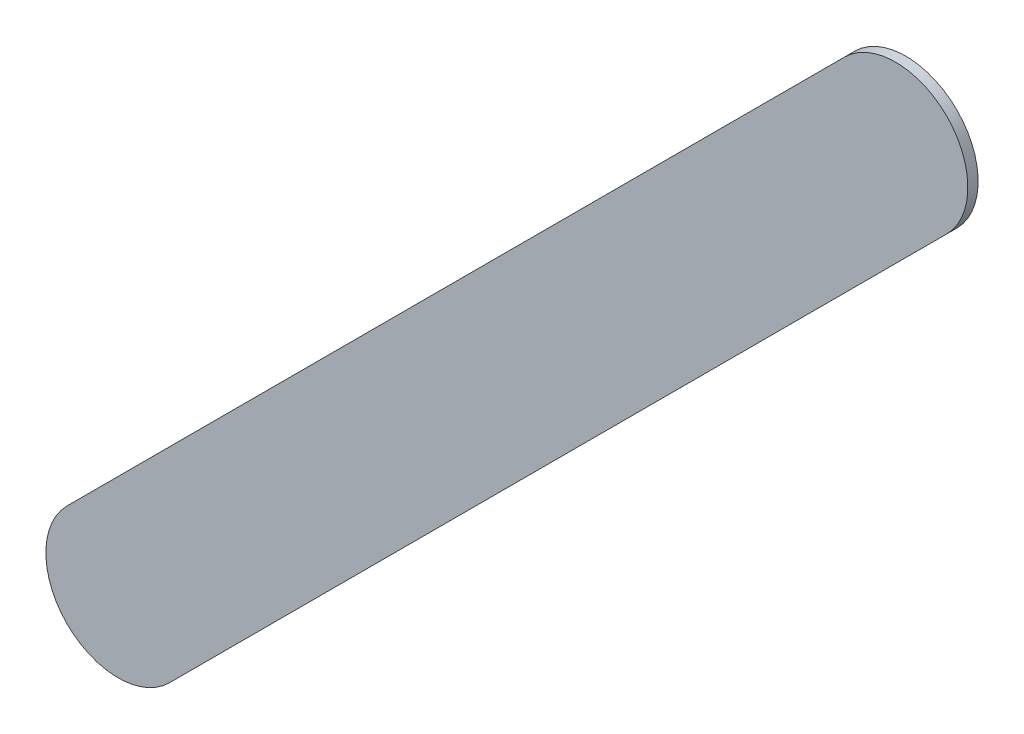
ISO-10303-21;
HEADER;
FILE_DESCRIPTION(('STEP AP214'),'2;1');
FILE_NAME('part.step','',(''),(''),'','','');
FILE_SCHEMA(('AUTOMOTIVE_DESIGN { 1 0 10303 214 1 1 1 1 }'));
ENDSEC;
DATA;
#1=APPLICATION_CONTEXT('core data for automotive mechanical design processes');
#2=APPLICATION_PROTOCOL_DEFINITION('international standard','automotive_design',2000,#1);
#3=PRODUCT_CONTEXT('',#1,'mechanical');
#4=PRODUCT('Part','Part','',(#3));
#5=PRODUCT_RELATED_PRODUCT_CATEGORY('part','',(#4));
#6=PRODUCT_DEFINITION_FORMATION('','',#4);
#7=PRODUCT_DEFINITION_CONTEXT('part definition',#1,'design');
#8=PRODUCT_DEFINITION('design','',#6,#7);
#9=PRODUCT_DEFINITION_SHAPE('','',#8);
#10=(LENGTH_UNIT() NAMED_UNIT(*) SI_UNIT(.MILLI.,.METRE.));
#11=(NAMED_UNIT(*) PLANE_ANGLE_UNIT() SI_UNIT($,.RADIAN.));
#12=(NAMED_UNIT(*) SI_UNIT($,.STERADIAN.) SOLID_ANGLE_UNIT());
#13=UNCERTAINTY_MEASURE_WITH_UNIT(LENGTH_MEASURE(1.E-05),#10,'distance_accuracy_value','');
#14=(GEOMETRIC_REPRESENTATION_CONTEXT(3) GLOBAL_UNCERTAINTY_ASSIGNED_CONTEXT((#13)) GLOBAL_UNIT_ASSIGNED_CONTEXT((#10,
#11,#12)) REPRESENTATION_CONTEXT('',''));
#15=CARTESIAN_POINT('',(0.,0.,0.));
#16=DIRECTION('',(0.,0.,1.));
#17=DIRECTION('',(1.,0.,0.));
#18=AXIS2_PLACEMENT_3D('',#15,#16,#17);
#19=CARTESIAN_POINT('',(36.2544233,104.00086896,0.));
#20=DIRECTION('',(-0.707106781186548,0.707106781186548,0.));
#21=DIRECTION('',(0.707106781186548,0.707106781186548,0.));
#22=AXIS2_PLACEMENT_3D('',#19,#20,#21);
#23=PLANE('',#22);
#24=DIRECTION('',(0.707106781186548,0.707106781186548,0.));
#25=VECTOR('',#24,1.);
#26=CARTESIAN_POINT('',(36.2544233,104.00086896,0.03556));
#27=LINE('',#26,#25);
#28=CARTESIAN_POINT('',(36.2544233,104.00086896,0.03556));
#29=VERTEX_POINT('',#28);
#30=CARTESIAN_POINT('',(38.94478876,106.69123442,0.03556));
#31=VERTEX_POINT('',#30);
#32=EDGE_CURVE('E11',#29,#31,#27,.T.);
#33=ORIENTED_EDGE('',*,*,#32,.F.);
#34=DIRECTION('',(0.,0.,1.));
#35=VECTOR('',#34,1.);
#36=CARTESIAN_POINT('',(36.2544233,104.00086896,0.));
#37=LINE('',#36,#35);
#38=CARTESIAN_POINT('',(36.2544233,104.00086896,0.));
#39=VERTEX_POINT('',#38);
#40=EDGE_CURVE('E24',#39,#29,#37,.T.);
#41=ORIENTED_EDGE('',*,*,#40,.F.);
#42=DIRECTION('',(0.707106781186548,0.707106781186548,0.));
#43=VECTOR('',#42,1.);
#44=CARTESIAN_POINT('',(36.2544233,104.00086896,0.));
#45=LINE('',#44,#43);
#46=CARTESIAN_POINT('',(38.94478876,106.69123442,0.));
#47=VERTEX_POINT('',#46);
#48=EDGE_CURVE('E75',#39,#47,#45,.T.);
#49=ORIENTED_EDGE('',*,*,#48,.T.);
#50=DIRECTION('',(0.,0.,1.));
#51=VECTOR('',#50,1.);
#52=CARTESIAN_POINT('',(38.94478876,106.69123442,0.));
#53=LINE('',#52,#51);
#54=EDGE_CURVE('E37',#47,#31,#53,.T.);
#55=ORIENTED_EDGE('',*,*,#54,.T.);
#56=EDGE_LOOP('',(#33,#41,#49,#55));
#57=FACE_BOUND('',#56,.T.);
#58=ADVANCED_FACE('F17',(#57),#23,.F.);
#59=CARTESIAN_POINT('',(38.76801238,106.8680108,0.));
#60=DIRECTION('',(0.,0.,-1.));
#61=DIRECTION('',(0.707106781186548,-0.707106781186548,0.));
#62=AXIS2_PLACEMENT_3D('',#59,#60,#61);
#63=CYLINDRICAL_SURFACE('',#62,0.249999554103218);
#64=CARTESIAN_POINT('',(38.76801238,106.8680108,0.03556));
#65=DIRECTION('',(0.,0.,1.));
#66=DIRECTION('',(0.707106781186548,-0.707106781186548,0.));
#67=AXIS2_PLACEMENT_3D('',#64,#65,#66);
#68=CIRCLE('',#67,0.249999554103218);
#69=CARTESIAN_POINT('',(38.591236,107.04478718,0.03556));
#70=VERTEX_POINT('',#69);
#71=EDGE_CURVE('E83',#31,#70,#68,.T.);
#72=ORIENTED_EDGE('',*,*,#71,.F.);
#73=ORIENTED_EDGE('',*,*,#54,.F.);
#74=CARTESIAN_POINT('',(38.76801238,106.8680108,0.));
#75=DIRECTION('',(0.,0.,1.));
#76=DIRECTION('',(0.707106781186548,-0.707106781186548,0.));
#77=AXIS2_PLACEMENT_3D('',#74,#75,#76);
#78=CIRCLE('',#77,0.249999554103218);
#79=CARTESIAN_POINT('',(38.591236,107.04478718,0.));
#80=VERTEX_POINT('',#79);
#81=EDGE_CURVE('E81',#47,#80,#78,.T.);
#82=ORIENTED_EDGE('',*,*,#81,.T.);
#83=DIRECTION('',(0.,0.,1.));
#84=VECTOR('',#83,1.);
#85=CARTESIAN_POINT('',(38.591236,107.04478718,0.));
#86=LINE('',#85,#84);
#87=EDGE_CURVE('E67',#80,#70,#86,.T.);
#88=ORIENTED_EDGE('',*,*,#87,.T.);
#89=EDGE_LOOP('',(#72,#73,#82,#88));
#90=FACE_BOUND('',#89,.T.);
#91=ADVANCED_FACE('F89',(#90),#63,.T.);
#92=CARTESIAN_POINT('',(38.591236,107.04478718,0.));
#93=DIRECTION('',(0.707106781186547,-0.707106781186549,0.));
#94=DIRECTION('',(-0.707106781186549,-0.707106781186547,0.));
#95=AXIS2_PLACEMENT_3D('',#92,#93,#94);
#96=PLANE('',#95);
#97=DIRECTION('',(-0.707106781186549,-0.707106781186547,0.));
#98=VECTOR('',#97,1.);
#99=CARTESIAN_POINT('',(38.591236,107.04478718,0.03556));
#100=LINE('',#99,#98);
#101=CARTESIAN_POINT('',(35.90087054,104.35442172,0.03556));
#102=VERTEX_POINT('',#101);
#103=EDGE_CURVE('E71',#70,#102,#100,.T.);
#104=ORIENTED_EDGE('',*,*,#103,.F.);
#105=ORIENTED_EDGE('',*,*,#87,.F.);
#106=DIRECTION('',(-0.707106781186549,-0.707106781186547,0.));
#107=VECTOR('',#106,1.);
#108=CARTESIAN_POINT('',(38.591236,107.04478718,0.));
#109=LINE('',#108,#107);
#110=CARTESIAN_POINT('',(35.90087054,104.35442172,0.));
#111=VERTEX_POINT('',#110);
#112=EDGE_CURVE('E63',#80,#111,#109,.T.);
#113=ORIENTED_EDGE('',*,*,#112,.T.);
#114=DIRECTION('',(0.,0.,1.));
#115=VECTOR('',#114,1.);
#116=CARTESIAN_POINT('',(35.90087054,104.35442172,0.));
#117=LINE('',#116,#115);
#118=EDGE_CURVE('E53',#111,#102,#117,.T.);
#119=ORIENTED_EDGE('',*,*,#118,.T.);
#120=EDGE_LOOP('',(#104,#105,#113,#119));
#121=FACE_BOUND('',#120,.T.);
#122=ADVANCED_FACE('F66',(#121),#96,.F.);
#123=CARTESIAN_POINT('',(36.07764692,104.17764534,0.));
#124=DIRECTION('',(0.,0.,-1.));
#125=DIRECTION('',(-0.707106781186562,0.707106781186533,0.));
#126=AXIS2_PLACEMENT_3D('',#123,#124,#125);
#127=CYLINDRICAL_SURFACE('',#126,0.249999554103221);
#128=CARTESIAN_POINT('',(36.07764692,104.17764534,0.03556));
#129=DIRECTION('',(0.,0.,1.));
#130=DIRECTION('',(-0.707106781186562,0.707106781186533,0.));
#131=AXIS2_PLACEMENT_3D('',#128,#129,#130);
#132=CIRCLE('',#131,0.249999554103221);
#133=EDGE_CURVE('E59',#102,#29,#132,.T.);
#134=ORIENTED_EDGE('',*,*,#133,.F.);
#135=ORIENTED_EDGE('',*,*,#118,.F.);
#136=CARTESIAN_POINT('',(36.07764692,104.17764534,0.));
#137=DIRECTION('',(0.,0.,1.));
#138=DIRECTION('',(-0.707106781186562,0.707106781186533,0.));
#139=AXIS2_PLACEMENT_3D('',#136,#137,#138);
#140=CIRCLE('',#139,0.249999554103221);
#141=EDGE_CURVE('E57',#111,#39,#140,.T.);
#142=ORIENTED_EDGE('',*,*,#141,.T.);
#143=ORIENTED_EDGE('',*,*,#40,.T.);
#144=EDGE_LOOP('',(#134,#135,#142,#143));
#145=FACE_BOUND('',#144,.T.);
#146=ADVANCED_FACE('F55',(#145),#127,.T.);
#147=CARTESIAN_POINT('',(36.2544233,104.00086896,0.));
#148=DIRECTION('',(0.,0.,-1.));
#149=DIRECTION('',(-1.,0.,0.));
#150=AXIS2_PLACEMENT_3D('',#147,#148,#149);
#151=PLANE('',#150);
#152=ORIENTED_EDGE('',*,*,#141,.F.);
#153=ORIENTED_EDGE('',*,*,#112,.F.);
#154=ORIENTED_EDGE('',*,*,#81,.F.);
#155=ORIENTED_EDGE('',*,*,#48,.F.);
#156=EDGE_LOOP('',(#152,#153,#154,#155));
#157=FACE_BOUND('',#156,.T.);
#158=ADVANCED_FACE('F74',(#157),#151,.T.);
#159=CARTESIAN_POINT('',(36.2544233,104.00086896,0.03556));
#160=DIRECTION('',(0.,0.,-1.));
#161=DIRECTION('',(-1.,0.,0.));
#162=AXIS2_PLACEMENT_3D('',#159,#160,#161);
#163=PLANE('',#162);
#164=ORIENTED_EDGE('',*,*,#32,.T.);
#165=ORIENTED_EDGE('',*,*,#71,.T.);
#166=ORIENTED_EDGE('',*,*,#103,.T.);
#167=ORIENTED_EDGE('',*,*,#133,.T.);
#168=EDGE_LOOP('',(#164,#165,#166,#167));
#169=FACE_BOUND('',#168,.T.);
#170=ADVANCED_FACE('F91',(#169),#163,.F.);
#171=CLOSED_SHELL('',(#58,#91,#122,#146,#158,#170));
#172=MANIFOLD_SOLID_BREP('B1',#171);
#173=ADVANCED_BREP_SHAPE_REPRESENTATION('',(#18,#172),#14);
#174=SHAPE_DEFINITION_REPRESENTATION(#9,#173);
ENDSEC;
END-ISO-10303-21;
